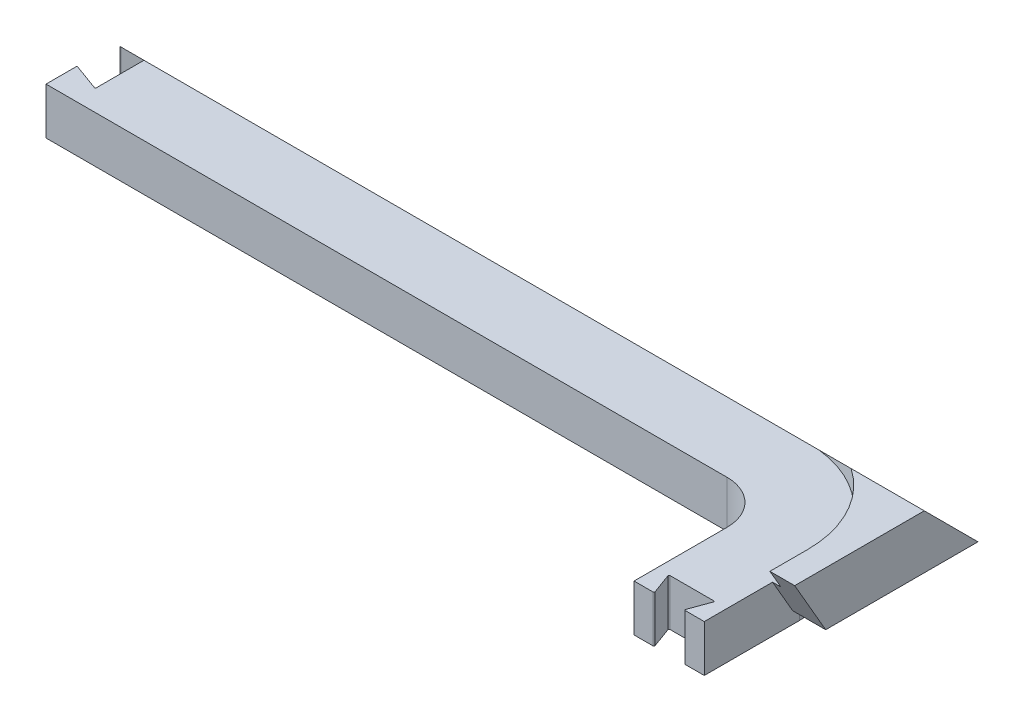
ISO-10303-21;
HEADER;
FILE_DESCRIPTION(('STEP AP214'),'2;1');
FILE_NAME('part.step','',(''),(''),'','','');
FILE_SCHEMA(('AUTOMOTIVE_DESIGN { 1 0 10303 214 1 1 1 1 }'));
ENDSEC;
DATA;
#1=APPLICATION_CONTEXT('core data for automotive mechanical design processes');
#2=APPLICATION_PROTOCOL_DEFINITION('international standard','automotive_design',2000,#1);
#3=PRODUCT_CONTEXT('',#1,'mechanical');
#4=PRODUCT('Part','Part','',(#3));
#5=PRODUCT_RELATED_PRODUCT_CATEGORY('part','',(#4));
#6=PRODUCT_DEFINITION_FORMATION('','',#4);
#7=PRODUCT_DEFINITION_CONTEXT('part definition',#1,'design');
#8=PRODUCT_DEFINITION('design','',#6,#7);
#9=PRODUCT_DEFINITION_SHAPE('','',#8);
#10=(LENGTH_UNIT() NAMED_UNIT(*) SI_UNIT(.MILLI.,.METRE.));
#11=(NAMED_UNIT(*) PLANE_ANGLE_UNIT() SI_UNIT($,.RADIAN.));
#12=(NAMED_UNIT(*) SI_UNIT($,.STERADIAN.) SOLID_ANGLE_UNIT());
#13=UNCERTAINTY_MEASURE_WITH_UNIT(LENGTH_MEASURE(1.E-05),#10,'distance_accuracy_value','');
#14=(GEOMETRIC_REPRESENTATION_CONTEXT(3) GLOBAL_UNCERTAINTY_ASSIGNED_CONTEXT((#13)) GLOBAL_UNIT_ASSIGNED_CONTEXT((#10,
#11,#12)) REPRESENTATION_CONTEXT('',''));
#15=CARTESIAN_POINT('',(0.,0.,0.));
#16=DIRECTION('',(0.,0.,1.));
#17=DIRECTION('',(1.,0.,0.));
#18=AXIS2_PLACEMENT_3D('',#15,#16,#17);
#19=CARTESIAN_POINT('',(0.,0.,-307.275));
#20=DIRECTION('',(0.,0.,-1.));
#21=DIRECTION('',(-1.,0.,0.));
#22=AXIS2_PLACEMENT_3D('',#19,#20,#21);
#23=PLANE('',#22);
#24=DIRECTION('',(-1.,0.,0.));
#25=VECTOR('',#24,1.);
#26=CARTESIAN_POINT('',(-357.675,0.,-307.275));
#27=LINE('',#26,#25);
#28=CARTESIAN_POINT('',(-12.3856296013484,0.,-307.275));
#29=VERTEX_POINT('',#28);
#30=CARTESIAN_POINT('',(-17.,0.,-307.275));
#31=VERTEX_POINT('',#30);
#32=EDGE_CURVE('E316',#29,#31,#27,.T.);
#33=ORIENTED_EDGE('',*,*,#32,.F.);
#34=DIRECTION('',(0.,1.,0.));
#35=VECTOR('',#34,1.);
#36=CARTESIAN_POINT('',(-12.3856296013484,0.,-307.275));
#37=LINE('',#36,#35);
#38=CARTESIAN_POINT('',(-12.3856296013484,11.31,-307.275));
#39=VERTEX_POINT('',#38);
#40=EDGE_CURVE('E412',#29,#39,#37,.T.);
#41=ORIENTED_EDGE('',*,*,#40,.T.);
#42=DIRECTION('',(-1.,0.,0.));
#43=VECTOR('',#42,1.);
#44=CARTESIAN_POINT('',(-357.675,11.31,-307.275));
#45=LINE('',#44,#43);
#46=CARTESIAN_POINT('',(-17.,11.31,-307.275));
#47=VERTEX_POINT('',#46);
#48=EDGE_CURVE('E301',#39,#47,#45,.T.);
#49=ORIENTED_EDGE('',*,*,#48,.T.);
#50=DIRECTION('',(0.,-1.,0.));
#51=VECTOR('',#50,1.);
#52=CARTESIAN_POINT('',(-17.,2.9,-307.275));
#53=LINE('',#52,#51);
#54=EDGE_CURVE('E311',#47,#31,#53,.T.);
#55=ORIENTED_EDGE('',*,*,#54,.T.);
#56=EDGE_LOOP('',(#33,#41,#49,#55));
#57=FACE_BOUND('',#56,.T.);
#58=ADVANCED_FACE('F46',(#57),#23,.F.);
#59=CARTESIAN_POINT('',(-192.3375,0.,0.));
#60=DIRECTION('',(-1.,0.,0.));
#61=DIRECTION('',(0.,0.,1.));
#62=AXIS2_PLACEMENT_3D('',#59,#60,#61);
#63=PLANE('',#62);
#64=DIRECTION('',(0.,0.,1.));
#65=VECTOR('',#64,1.);
#66=CARTESIAN_POINT('',(-192.3375,2.9,0.));
#67=LINE('',#66,#65);
#68=CARTESIAN_POINT('',(-192.3375,2.9,-365.530226968426));
#69=VERTEX_POINT('',#68);
#70=CARTESIAN_POINT('',(-192.3375,2.9,-358.288243085561));
#71=VERTEX_POINT('',#70);
#72=EDGE_CURVE('E306',#69,#71,#67,.T.);
#73=ORIENTED_EDGE('',*,*,#72,.T.);
#74=DIRECTION('',(0.,1.,0.));
#75=VECTOR('',#74,1.);
#76=CARTESIAN_POINT('',(-192.3375,10.4276134842131,-358.288243085561));
#77=LINE('',#76,#75);
#78=CARTESIAN_POINT('',(-192.3375,10.1419838828646,-358.288243085561));
#79=VERTEX_POINT('',#78);
#80=EDGE_CURVE('E396',#71,#79,#77,.T.);
#81=ORIENTED_EDGE('',*,*,#80,.T.);
#82=DIRECTION('',(0.,-0.707106781186551,-0.707106781186544));
#83=VECTOR('',#82,1.);
#84=CARTESIAN_POINT('',(-192.3375,-2.49586231119696,-370.926089279623));
#85=LINE('',#84,#83);
#86=EDGE_CURVE('E298',#79,#69,#85,.T.);
#87=ORIENTED_EDGE('',*,*,#86,.T.);
#88=EDGE_LOOP('',(#73,#81,#87));
#89=FACE_BOUND('',#88,.T.);
#90=ADVANCED_FACE('F616',(#89),#63,.T.);
#91=CARTESIAN_POINT('',(0.,11.31,-307.275));
#92=VERTEX_POINT('',#91);
#93=CARTESIAN_POINT('',(-4.61437039865159,11.31,-307.275));
#94=VERTEX_POINT('',#93);
#95=EDGE_CURVE('E307',#92,#94,#45,.T.);
#96=ORIENTED_EDGE('',*,*,#95,.T.);
#97=DIRECTION('',(0.,1.,0.));
#98=VECTOR('',#97,1.);
#99=CARTESIAN_POINT('',(-4.61437039865159,0.,-307.275));
#100=LINE('',#99,#98);
#101=CARTESIAN_POINT('',(-4.61437039865159,0.,-307.275));
#102=VERTEX_POINT('',#101);
#103=EDGE_CURVE('E437',#94,#102,#100,.F.);
#104=ORIENTED_EDGE('',*,*,#103,.T.);
#105=CARTESIAN_POINT('',(0.,0.,-307.275));
#106=VERTEX_POINT('',#105);
#107=EDGE_CURVE('E322',#106,#102,#27,.T.);
#108=ORIENTED_EDGE('',*,*,#107,.F.);
#109=DIRECTION('',(0.,-1.,0.));
#110=VECTOR('',#109,1.);
#111=CARTESIAN_POINT('',(0.,2.9,-307.275));
#112=LINE('',#111,#110);
#113=EDGE_CURVE('E317',#92,#106,#112,.T.);
#114=ORIENTED_EDGE('',*,*,#113,.F.);
#115=EDGE_LOOP('',(#96,#104,#108,#114));
#116=FACE_BOUND('',#115,.T.);
#117=ADVANCED_FACE('F618',(#116),#23,.F.);
#118=DIRECTION('',(0.,0.,1.));
#119=VECTOR('',#118,1.);
#120=CARTESIAN_POINT('',(-192.3375,11.31,-330.275));
#121=LINE('',#120,#119);
#122=CARTESIAN_POINT('',(-192.3375,11.31,-347.516983882865));
#123=VERTEX_POINT('',#122);
#124=CARTESIAN_POINT('',(-192.3375,11.31,-340.275));
#125=VERTEX_POINT('',#124);
#126=EDGE_CURVE('E318',#123,#125,#121,.T.);
#127=ORIENTED_EDGE('',*,*,#126,.F.);
#128=DIRECTION('',(0.,1.,0.));
#129=VECTOR('',#128,1.);
#130=CARTESIAN_POINT('',(-192.3375,0.,-347.516983882865));
#131=LINE('',#130,#129);
#132=CARTESIAN_POINT('',(-192.3375,0.,-347.516983882865));
#133=VERTEX_POINT('',#132);
#134=EDGE_CURVE('E378',#123,#133,#131,.F.);
#135=ORIENTED_EDGE('',*,*,#134,.T.);
#136=DIRECTION('',(0.,0.,1.));
#137=VECTOR('',#136,1.);
#138=CARTESIAN_POINT('',(-192.3375,0.,-330.275));
#139=LINE('',#138,#137);
#140=CARTESIAN_POINT('',(-192.3375,0.,-340.275));
#141=VERTEX_POINT('',#140);
#142=EDGE_CURVE('E303',#133,#141,#139,.T.);
#143=ORIENTED_EDGE('',*,*,#142,.T.);
#144=DIRECTION('',(0.,-1.,0.));
#145=VECTOR('',#144,1.);
#146=CARTESIAN_POINT('',(-192.3375,2.9,-340.275));
#147=LINE('',#146,#145);
#148=EDGE_CURVE('E312',#125,#141,#147,.T.);
#149=ORIENTED_EDGE('',*,*,#148,.F.);
#150=EDGE_LOOP('',(#127,#135,#143,#149));
#151=FACE_BOUND('',#150,.T.);
#152=ADVANCED_FACE('F625',(#151),#63,.T.);
#153=CARTESIAN_POINT('',(-357.675,0.,-330.275));
#154=DIRECTION('',(0.,1.,0.));
#155=DIRECTION('',(0.,0.,1.));
#156=AXIS2_PLACEMENT_3D('',#153,#154,#155);
#157=PLANE('',#156);
#158=ORIENTED_EDGE('',*,*,#142,.F.);
#159=CARTESIAN_POINT('',(-192.1375,0.,-347.516983882865));
#160=DIRECTION('',(0.,1.,0.));
#161=DIRECTION('',(0.,0.,1.));
#162=AXIS2_PLACEMENT_3D('',#159,#160,#161);
#163=CIRCLE('',#162,0.2);
#164=CARTESIAN_POINT('',(-192.069095971335,0.,-347.704922407022));
#165=VERTEX_POINT('',#164);
#166=EDGE_CURVE('E387',#133,#165,#163,.F.);
#167=ORIENTED_EDGE('',*,*,#166,.T.);
#168=DIRECTION('',(0.939692620785907,0.,0.342020143325674));
#169=VECTOR('',#168,1.);
#170=CARTESIAN_POINT('',(-185.468806451364,0.,-345.302613484213));
#171=LINE('',#170,#169);
#172=CARTESIAN_POINT('',(-185.737210480029,0.,-345.400304561404));
#173=VERTEX_POINT('',#172);
#174=EDGE_CURVE('E266',#165,#173,#171,.T.);
#175=ORIENTED_EDGE('',*,*,#174,.T.);
#176=CARTESIAN_POINT('',(-185.668806451364,0.,-345.588243085561));
#177=DIRECTION('',(0.,1.,0.));
#178=DIRECTION('',(0.,0.,1.));
#179=AXIS2_PLACEMENT_3D('',#176,#177,#178);
#180=CIRCLE('',#179,0.2);
#181=CARTESIAN_POINT('',(-185.468806451364,0.,-345.588243085561));
#182=VERTEX_POINT('',#181);
#183=EDGE_CURVE('E260',#173,#182,#180,.T.);
#184=ORIENTED_EDGE('',*,*,#183,.T.);
#185=DIRECTION('',(0.,0.,-1.));
#186=VECTOR('',#185,1.);
#187=CARTESIAN_POINT('',(-185.468806451364,0.,-360.502613484213));
#188=LINE('',#187,#186);
#189=CARTESIAN_POINT('',(-185.468806451364,0.,-357.275));
#190=VERTEX_POINT('',#189);
#191=EDGE_CURVE('E251',#182,#190,#188,.T.);
#192=ORIENTED_EDGE('',*,*,#191,.T.);
#193=DIRECTION('',(-1.,0.,0.));
#194=VECTOR('',#193,1.);
#195=CARTESIAN_POINT('',(-357.675,0.,-357.275));
#196=LINE('',#195,#194);
#197=CARTESIAN_POINT('',(-27.,0.,-357.275));
#198=VERTEX_POINT('',#197);
#199=EDGE_CURVE('E257',#198,#190,#196,.T.);
#200=ORIENTED_EDGE('',*,*,#199,.F.);
#201=CARTESIAN_POINT('',(-27.,0.,-330.275));
#202=DIRECTION('',(0.,1.,0.));
#203=DIRECTION('',(0.,0.,1.));
#204=AXIS2_PLACEMENT_3D('',#201,#202,#203);
#205=CIRCLE('',#204,27.);
#206=CARTESIAN_POINT('',(0.,0.,-330.275));
#207=VERTEX_POINT('',#206);
#208=EDGE_CURVE('E282',#207,#198,#205,.T.);
#209=ORIENTED_EDGE('',*,*,#208,.F.);
#210=DIRECTION('',(0.,0.,-1.));
#211=VECTOR('',#210,1.);
#212=CARTESIAN_POINT('',(0.,0.,0.));
#213=LINE('',#212,#211);
#214=EDGE_CURVE('E287',#106,#207,#213,.T.);
#215=ORIENTED_EDGE('',*,*,#214,.F.);
#216=ORIENTED_EDGE('',*,*,#107,.T.);
#217=CARTESIAN_POINT('',(-4.61437039865159,0.,-307.475));
#218=DIRECTION('',(0.,1.,0.));
#219=DIRECTION('',(0.,0.,1.));
#220=AXIS2_PLACEMENT_3D('',#217,#218,#219);
#221=CIRCLE('',#220,0.2);
#222=CARTESIAN_POINT('',(-4.80230892280877,0.,-307.543404028665));
#223=VERTEX_POINT('',#222);
#224=EDGE_CURVE('E381',#102,#223,#221,.F.);
#225=ORIENTED_EDGE('',*,*,#224,.T.);
#226=DIRECTION('',(0.342020143325664,0.,-0.93969262078591));
#227=VECTOR('',#226,1.);
#228=CARTESIAN_POINT('',(-4.90000000000001,0.,-307.275));
#229=LINE('',#228,#227);
#230=CARTESIAN_POINT('',(-2.99769107719125,0.,-312.501550810244));
#231=VERTEX_POINT('',#230);
#232=EDGE_CURVE('E475',#223,#231,#229,.T.);
#233=ORIENTED_EDGE('',*,*,#232,.T.);
#234=CARTESIAN_POINT('',(-3.18562960134843,0.,-312.569954838909));
#235=DIRECTION('',(0.,1.,0.));
#236=DIRECTION('',(0.,0.,1.));
#237=AXIS2_PLACEMENT_3D('',#234,#235,#236);
#238=CIRCLE('',#237,0.2);
#239=CARTESIAN_POINT('',(-3.18562960134843,0.,-312.769954838909));
#240=VERTEX_POINT('',#239);
#241=EDGE_CURVE('E11',#231,#240,#238,.T.);
#242=ORIENTED_EDGE('',*,*,#241,.T.);
#243=DIRECTION('',(-1.,0.,0.));
#244=VECTOR('',#243,1.);
#245=CARTESIAN_POINT('',(-2.90000000000001,0.,-312.769954838909));
#246=LINE('',#245,#244);
#247=CARTESIAN_POINT('',(-13.8143703986516,0.,-312.769954838909));
#248=VERTEX_POINT('',#247);
#249=EDGE_CURVE('E473',#240,#248,#246,.T.);
#250=ORIENTED_EDGE('',*,*,#249,.T.);
#251=CARTESIAN_POINT('',(-13.8143703986516,0.,-312.569954838909));
#252=DIRECTION('',(0.,1.,0.));
#253=DIRECTION('',(0.,0.,1.));
#254=AXIS2_PLACEMENT_3D('',#251,#252,#253);
#255=CIRCLE('',#254,0.2);
#256=CARTESIAN_POINT('',(-14.0023089228088,0.,-312.501550810244));
#257=VERTEX_POINT('',#256);
#258=EDGE_CURVE('E453',#248,#257,#255,.T.);
#259=ORIENTED_EDGE('',*,*,#258,.T.);
#260=DIRECTION('',(0.342020143325664,0.,0.93969262078591));
#261=VECTOR('',#260,1.);
#262=CARTESIAN_POINT('',(-14.1,0.,-312.769954838909));
#263=LINE('',#262,#261);
#264=CARTESIAN_POINT('',(-12.1976910771912,0.,-307.543404028665));
#265=VERTEX_POINT('',#264);
#266=EDGE_CURVE('E484',#257,#265,#263,.T.);
#267=ORIENTED_EDGE('',*,*,#266,.T.);
#268=CARTESIAN_POINT('',(-12.3856296013484,0.,-307.475));
#269=DIRECTION('',(0.,1.,0.));
#270=DIRECTION('',(0.,0.,1.));
#271=AXIS2_PLACEMENT_3D('',#268,#269,#270);
#272=CIRCLE('',#271,0.2);
#273=EDGE_CURVE('E384',#265,#29,#272,.F.);
#274=ORIENTED_EDGE('',*,*,#273,.T.);
#275=ORIENTED_EDGE('',*,*,#32,.T.);
#276=DIRECTION('',(0.,0.,-1.));
#277=VECTOR('',#276,1.);
#278=CARTESIAN_POINT('',(-17.,0.,-17.));
#279=LINE('',#278,#277);
#280=CARTESIAN_POINT('',(-17.,0.,-329.775));
#281=VERTEX_POINT('',#280);
#282=EDGE_CURVE('E337',#31,#281,#279,.T.);
#283=ORIENTED_EDGE('',*,*,#282,.T.);
#284=CARTESIAN_POINT('',(-27.5,0.,-329.775));
#285=DIRECTION('',(0.,1.,0.));
#286=DIRECTION('',(0.,0.,1.));
#287=AXIS2_PLACEMENT_3D('',#284,#285,#286);
#288=CIRCLE('',#287,10.5);
#289=CARTESIAN_POINT('',(-27.5,0.,-340.275));
#290=VERTEX_POINT('',#289);
#291=EDGE_CURVE('E506',#281,#290,#288,.T.);
#292=ORIENTED_EDGE('',*,*,#291,.T.);
#293=DIRECTION('',(-1.,0.,0.));
#294=VECTOR('',#293,1.);
#295=CARTESIAN_POINT('',(-367.675,0.,-340.275));
#296=LINE('',#295,#294);
#297=EDGE_CURVE('E293',#290,#141,#296,.T.);
#298=ORIENTED_EDGE('',*,*,#297,.T.);
#299=EDGE_LOOP('',(#158,#167,#175,#184,#192,#200,#209,#215,#216,#225,#233,#242,#250,#259,#267,
#274,#275,#283,#292,#298));
#300=FACE_BOUND('',#299,.T.);
#301=ADVANCED_FACE('F254',(#300),#157,.F.);
#302=CARTESIAN_POINT('',(-27.,2.9,-330.275));
#303=DIRECTION('',(0.,-1.,0.));
#304=DIRECTION('',(0.,0.,-1.));
#305=AXIS2_PLACEMENT_3D('',#302,#303,#304);
#306=CYLINDRICAL_SURFACE('',#305,27.);
#307=ORIENTED_EDGE('',*,*,#208,.T.);
#308=DIRECTION('',(0.,-1.,0.));
#309=VECTOR('',#308,1.);
#310=CARTESIAN_POINT('',(-27.,2.9,-357.275));
#311=LINE('',#310,#309);
#312=CARTESIAN_POINT('',(-27.,2.9,-357.275));
#313=VERTEX_POINT('',#312);
#314=EDGE_CURVE('E280',#313,#198,#311,.T.);
#315=ORIENTED_EDGE('',*,*,#314,.F.);
#316=CARTESIAN_POINT('',(-27.,2.9,-330.275));
#317=DIRECTION('',(0.,1.,0.));
#318=DIRECTION('',(0.,0.,1.));
#319=AXIS2_PLACEMENT_3D('',#316,#317,#318);
#320=CIRCLE('',#319,27.);
#321=CARTESIAN_POINT('',(0.,2.9,-330.275));
#322=VERTEX_POINT('',#321);
#323=EDGE_CURVE('E289',#322,#313,#320,.T.);
#324=ORIENTED_EDGE('',*,*,#323,.F.);
#325=DIRECTION('',(0.,-1.,0.));
#326=VECTOR('',#325,1.);
#327=CARTESIAN_POINT('',(0.,2.9,-330.275));
#328=LINE('',#327,#326);
#329=EDGE_CURVE('E517',#322,#207,#328,.T.);
#330=ORIENTED_EDGE('',*,*,#329,.T.);
#331=EDGE_LOOP('',(#307,#315,#324,#330));
#332=FACE_BOUND('',#331,.T.);
#333=ADVANCED_FACE('F910',(#332),#306,.T.);
#334=CARTESIAN_POINT('',(2.,15.900012,0.));
#335=DIRECTION('',(1.,0.,0.));
#336=DIRECTION('',(0.,0.,-1.));
#337=AXIS2_PLACEMENT_3D('',#334,#335,#336);
#338=PLANE('',#337);
#339=DIRECTION('',(0.,0.,-1.));
#340=VECTOR('',#339,1.);
#341=CARTESIAN_POINT('',(2.,15.9,0.));
#342=LINE('',#341,#340);
#343=CARTESIAN_POINT('',(2.,15.9,-321.157113764813));
#344=VERTEX_POINT('',#343);
#345=CARTESIAN_POINT('',(2.,15.9,-330.275));
#346=VERTEX_POINT('',#345);
#347=EDGE_CURVE('E333',#344,#346,#342,.T.);
#348=ORIENTED_EDGE('',*,*,#347,.T.);
#349=DIRECTION('',(0.,1.,0.));
#350=VECTOR('',#349,1.);
#351=CARTESIAN_POINT('',(2.,11.31,-330.275));
#352=LINE('',#351,#350);
#353=CARTESIAN_POINT('',(2.,11.31,-330.275));
#354=VERTEX_POINT('',#353);
#355=EDGE_CURVE('E326',#354,#346,#352,.T.);
#356=ORIENTED_EDGE('',*,*,#355,.F.);
#357=DIRECTION('',(0.,0.,1.));
#358=VECTOR('',#357,1.);
#359=CARTESIAN_POINT('',(2.,11.31,0.));
#360=LINE('',#359,#358);
#361=CARTESIAN_POINT('',(2.,11.31,-323.807151500394));
#362=VERTEX_POINT('',#361);
#363=EDGE_CURVE('E561',#354,#362,#360,.T.);
#364=ORIENTED_EDGE('',*,*,#363,.T.);
#365=DIRECTION('',(0.,0.866025403784438,0.500000000000001));
#366=VECTOR('',#365,1.);
#367=CARTESIAN_POINT('',(2.,15.9,-321.157113764813));
#368=LINE('',#367,#366);
#369=EDGE_CURVE('E332',#362,#344,#368,.T.);
#370=ORIENTED_EDGE('',*,*,#369,.T.);
#371=EDGE_LOOP('',(#348,#356,#364,#370));
#372=FACE_BOUND('',#371,.T.);
#373=ADVANCED_FACE('F654',(#372),#338,.F.);
#374=CARTESIAN_POINT('',(0.,15.9,-321.157113764813));
#375=DIRECTION('',(0.,-0.500000000000001,0.866025403784438));
#376=DIRECTION('',(0.,-0.866025403784438,-0.500000000000001));
#377=AXIS2_PLACEMENT_3D('',#374,#375,#376);
#378=PLANE('',#377);
#379=ORIENTED_EDGE('',*,*,#369,.F.);
#380=DIRECTION('',(-1.,0.,0.));
#381=VECTOR('',#380,1.);
#382=CARTESIAN_POINT('',(0.,11.31,-323.807151500394));
#383=LINE('',#382,#381);
#384=CARTESIAN_POINT('',(0.,11.31,-323.807151500394));
#385=VERTEX_POINT('',#384);
#386=EDGE_CURVE('E327',#362,#385,#383,.T.);
#387=ORIENTED_EDGE('',*,*,#386,.T.);
#388=DIRECTION('',(0.,-0.866025403784438,-0.500000000000001));
#389=VECTOR('',#388,1.);
#390=CARTESIAN_POINT('',(0.,15.9,-321.157113764813));
#391=LINE('',#390,#389);
#392=CARTESIAN_POINT('',(0.,2.9,-328.662667264279));
#393=VERTEX_POINT('',#392);
#394=EDGE_CURVE('E536',#385,#393,#391,.T.);
#395=ORIENTED_EDGE('',*,*,#394,.T.);
#396=DIRECTION('',(1.,0.,0.));
#397=VECTOR('',#396,1.);
#398=CARTESIAN_POINT('',(0.,2.9,-328.662667264279));
#399=LINE('',#398,#397);
#400=CARTESIAN_POINT('',(8.00000000000001,2.9,-328.662667264279));
#401=VERTEX_POINT('',#400);
#402=EDGE_CURVE('E529',#393,#401,#399,.T.);
#403=ORIENTED_EDGE('',*,*,#402,.T.);
#404=DIRECTION('',(0.,-0.866025403784438,-0.500000000000001));
#405=VECTOR('',#404,1.);
#406=CARTESIAN_POINT('',(8.00000000000001,15.9,-321.157113764813));
#407=LINE('',#406,#405);
#408=CARTESIAN_POINT('',(8.00000000000001,15.9,-321.157113764813));
#409=VERTEX_POINT('',#408);
#410=EDGE_CURVE('E336',#409,#401,#407,.T.);
#411=ORIENTED_EDGE('',*,*,#410,.F.);
#412=DIRECTION('',(1.,0.,0.));
#413=VECTOR('',#412,1.);
#414=CARTESIAN_POINT('',(0.,15.9,-321.157113764813));
#415=LINE('',#414,#413);
#416=EDGE_CURVE('E532',#344,#409,#415,.T.);
#417=ORIENTED_EDGE('',*,*,#416,.F.);
#418=EDGE_LOOP('',(#379,#387,#395,#403,#411,#417));
#419=FACE_BOUND('',#418,.T.);
#420=ADVANCED_FACE('F648',(#419),#378,.T.);
#421=CARTESIAN_POINT('',(0.,2.9,0.));
#422=DIRECTION('',(-1.,0.,0.));
#423=DIRECTION('',(0.,0.,1.));
#424=AXIS2_PLACEMENT_3D('',#421,#422,#423);
#425=PLANE('',#424);
#426=DIRECTION('',(0.,0.,-1.));
#427=VECTOR('',#426,1.);
#428=CARTESIAN_POINT('',(0.,11.31,0.));
#429=LINE('',#428,#427);
#430=EDGE_CURVE('E323',#92,#385,#429,.T.);
#431=ORIENTED_EDGE('',*,*,#430,.F.);
#432=ORIENTED_EDGE('',*,*,#113,.T.);
#433=ORIENTED_EDGE('',*,*,#214,.T.);
#434=ORIENTED_EDGE('',*,*,#329,.F.);
#435=DIRECTION('',(0.,0.,-1.));
#436=VECTOR('',#435,1.);
#437=CARTESIAN_POINT('',(0.,2.9,0.));
#438=LINE('',#437,#436);
#439=EDGE_CURVE('E283',#393,#322,#438,.T.);
#440=ORIENTED_EDGE('',*,*,#439,.F.);
#441=ORIENTED_EDGE('',*,*,#394,.F.);
#442=EDGE_LOOP('',(#431,#432,#433,#434,#440,#441));
#443=FACE_BOUND('',#442,.T.);
#444=ADVANCED_FACE('F641',(#443),#425,.F.);
#445=CARTESIAN_POINT('',(-17.,2.9,-17.));
#446=DIRECTION('',(-1.,0.,0.));
#447=DIRECTION('',(0.,0.,1.));
#448=AXIS2_PLACEMENT_3D('',#445,#446,#447);
#449=PLANE('',#448);
#450=ORIENTED_EDGE('',*,*,#54,.F.);
#451=DIRECTION('',(0.,0.,-1.));
#452=VECTOR('',#451,1.);
#453=CARTESIAN_POINT('',(-17.,11.31,-17.));
#454=LINE('',#453,#452);
#455=CARTESIAN_POINT('',(-17.,11.31,-329.775));
#456=VERTEX_POINT('',#455);
#457=EDGE_CURVE('E328',#47,#456,#454,.T.);
#458=ORIENTED_EDGE('',*,*,#457,.T.);
#459=DIRECTION('',(0.,-1.,0.));
#460=VECTOR('',#459,1.);
#461=CARTESIAN_POINT('',(-17.,0.,-329.775));
#462=LINE('',#461,#460);
#463=EDGE_CURVE('E513',#456,#281,#462,.T.);
#464=ORIENTED_EDGE('',*,*,#463,.T.);
#465=ORIENTED_EDGE('',*,*,#282,.F.);
#466=EDGE_LOOP('',(#450,#458,#464,#465));
#467=FACE_BOUND('',#466,.T.);
#468=ADVANCED_FACE('F605',(#467),#449,.T.);
#469=CARTESIAN_POINT('',(-27.5,2.9,-329.775));
#470=DIRECTION('',(0.,1.,0.));
#471=DIRECTION('',(0.,0.,1.));
#472=AXIS2_PLACEMENT_3D('',#469,#470,#471);
#473=CYLINDRICAL_SURFACE('',#472,10.5);
#474=CARTESIAN_POINT('',(-27.5,11.31,-329.775));
#475=DIRECTION('',(0.,1.,0.));
#476=DIRECTION('',(0.,0.,1.));
#477=AXIS2_PLACEMENT_3D('',#474,#475,#476);
#478=CIRCLE('',#477,10.5);
#479=CARTESIAN_POINT('',(-27.5,11.31,-340.275));
#480=VERTEX_POINT('',#479);
#481=EDGE_CURVE('E331',#480,#456,#478,.F.);
#482=ORIENTED_EDGE('',*,*,#481,.F.);
#483=DIRECTION('',(0.,-1.,0.));
#484=VECTOR('',#483,1.);
#485=CARTESIAN_POINT('',(-27.5,2.9,-340.275));
#486=LINE('',#485,#484);
#487=EDGE_CURVE('E509',#290,#480,#486,.F.);
#488=ORIENTED_EDGE('',*,*,#487,.F.);
#489=ORIENTED_EDGE('',*,*,#291,.F.);
#490=ORIENTED_EDGE('',*,*,#463,.F.);
#491=EDGE_LOOP('',(#482,#488,#489,#490));
#492=FACE_BOUND('',#491,.T.);
#493=ADVANCED_FACE('F600',(#492),#473,.F.);
#494=CARTESIAN_POINT('',(-367.675,2.9,-340.275));
#495=DIRECTION('',(0.,0.,1.));
#496=DIRECTION('',(1.,0.,0.));
#497=AXIS2_PLACEMENT_3D('',#494,#495,#496);
#498=PLANE('',#497);
#499=DIRECTION('',(-1.,0.,0.));
#500=VECTOR('',#499,1.);
#501=CARTESIAN_POINT('',(-367.675,11.31,-340.275));
#502=LINE('',#501,#500);
#503=EDGE_CURVE('E550',#480,#125,#502,.T.);
#504=ORIENTED_EDGE('',*,*,#503,.T.);
#505=ORIENTED_EDGE('',*,*,#148,.T.);
#506=ORIENTED_EDGE('',*,*,#297,.F.);
#507=ORIENTED_EDGE('',*,*,#487,.T.);
#508=EDGE_LOOP('',(#504,#505,#506,#507));
#509=FACE_BOUND('',#508,.T.);
#510=ADVANCED_FACE('F591',(#509),#498,.T.);
#511=CARTESIAN_POINT('',(0.,2.9,0.));
#512=DIRECTION('',(0.,1.,0.));
#513=DIRECTION('',(0.,0.,1.));
#514=AXIS2_PLACEMENT_3D('',#511,#512,#513);
#515=PLANE('',#514);
#516=DIRECTION('',(-0.939692620785907,0.,0.342020143325674));
#517=VECTOR('',#516,1.);
#518=CARTESIAN_POINT('',(-137.559035552329,2.9,-377.940344021975));
#519=LINE('',#518,#517);
#520=CARTESIAN_POINT('',(-185.737210480029,2.9,-360.404922407022));
#521=VERTEX_POINT('',#520);
#522=CARTESIAN_POINT('',(-192.069095971335,2.9,-358.100304561404));
#523=VERTEX_POINT('',#522);
#524=EDGE_CURVE('E302',#521,#523,#519,.T.);
#525=ORIENTED_EDGE('',*,*,#524,.T.);
#526=CARTESIAN_POINT('',(-192.1375,2.9,-358.288243085561));
#527=DIRECTION('',(0.,1.,0.));
#528=DIRECTION('',(0.,0.,1.));
#529=AXIS2_PLACEMENT_3D('',#526,#527,#528);
#530=CIRCLE('',#529,0.2);
#531=EDGE_CURVE('E409',#523,#71,#530,.F.);
#532=ORIENTED_EDGE('',*,*,#531,.T.);
#533=ORIENTED_EDGE('',*,*,#72,.F.);
#534=DIRECTION('',(1.,0.,0.));
#535=VECTOR('',#534,1.);
#536=CARTESIAN_POINT('',(0.,2.9,-365.530226968426));
#537=LINE('',#536,#535);
#538=CARTESIAN_POINT('',(8.,2.90000000000004,-365.530226968426));
#539=VERTEX_POINT('',#538);
#540=EDGE_CURVE('E565',#69,#539,#537,.T.);
#541=ORIENTED_EDGE('',*,*,#540,.T.);
#542=DIRECTION('',(0.,0.,1.));
#543=VECTOR('',#542,1.);
#544=CARTESIAN_POINT('',(8.00000000000006,2.9,0.));
#545=LINE('',#544,#543);
#546=EDGE_CURVE('E526',#539,#401,#545,.T.);
#547=ORIENTED_EDGE('',*,*,#546,.T.);
#548=ORIENTED_EDGE('',*,*,#402,.F.);
#549=ORIENTED_EDGE('',*,*,#439,.T.);
#550=ORIENTED_EDGE('',*,*,#323,.T.);
#551=DIRECTION('',(-1.,0.,0.));
#552=VECTOR('',#551,1.);
#553=CARTESIAN_POINT('',(-357.675,2.9,-357.275));
#554=LINE('',#553,#552);
#555=CARTESIAN_POINT('',(-185.468806451364,2.9,-357.275));
#556=VERTEX_POINT('',#555);
#557=EDGE_CURVE('E295',#313,#556,#554,.T.);
#558=ORIENTED_EDGE('',*,*,#557,.T.);
#559=DIRECTION('',(0.,0.,-1.));
#560=VECTOR('',#559,1.);
#561=CARTESIAN_POINT('',(-185.468806451364,2.9,0.));
#562=LINE('',#561,#560);
#563=CARTESIAN_POINT('',(-185.468806451364,2.9,-360.216983882864));
#564=VERTEX_POINT('',#563);
#565=EDGE_CURVE('E265',#556,#564,#562,.T.);
#566=ORIENTED_EDGE('',*,*,#565,.T.);
#567=CARTESIAN_POINT('',(-185.668806451364,2.9,-360.216983882864));
#568=DIRECTION('',(0.,1.,0.));
#569=DIRECTION('',(0.,0.,1.));
#570=AXIS2_PLACEMENT_3D('',#567,#568,#569);
#571=CIRCLE('',#570,0.2);
#572=EDGE_CURVE('E69',#564,#521,#571,.T.);
#573=ORIENTED_EDGE('',*,*,#572,.T.);
#574=EDGE_LOOP('',(#525,#532,#533,#541,#547,#548,#549,#550,#558,#566,#573));
#575=FACE_BOUND('',#574,.T.);
#576=ADVANCED_FACE('F864',(#575),#515,.F.);
#577=CARTESIAN_POINT('',(8.00000000000006,15.9,0.));
#578=DIRECTION('',(1.,0.,0.));
#579=DIRECTION('',(0.,0.,-1.));
#580=AXIS2_PLACEMENT_3D('',#577,#578,#579);
#581=PLANE('',#580);
#582=DIRECTION('',(0.,-0.707106781186551,-0.707106781186544));
#583=VECTOR('',#582,1.);
#584=CARTESIAN_POINT('',(8.00000000000003,192.165113484213,-176.265113484215));
#585=LINE('',#584,#583);
#586=CARTESIAN_POINT('',(8.00000000000001,15.9,-352.530226968426));
#587=VERTEX_POINT('',#586);
#588=EDGE_CURVE('E566',#587,#539,#585,.T.);
#589=ORIENTED_EDGE('',*,*,#588,.F.);
#590=DIRECTION('',(0.,0.,1.));
#591=VECTOR('',#590,1.);
#592=CARTESIAN_POINT('',(8.00000000000006,15.9,0.));
#593=LINE('',#592,#591);
#594=EDGE_CURVE('E340',#587,#409,#593,.T.);
#595=ORIENTED_EDGE('',*,*,#594,.T.);
#596=ORIENTED_EDGE('',*,*,#410,.T.);
#597=ORIENTED_EDGE('',*,*,#546,.F.);
#598=EDGE_LOOP('',(#589,#595,#596,#597));
#599=FACE_BOUND('',#598,.T.);
#600=ADVANCED_FACE('F854',(#599),#581,.T.);
#601=CARTESIAN_POINT('',(0.,15.9,0.));
#602=DIRECTION('',(0.,1.,0.));
#603=DIRECTION('',(0.,0.,1.));
#604=AXIS2_PLACEMENT_3D('',#601,#602,#603);
#605=PLANE('',#604);
#606=DIRECTION('',(1.,0.,0.));
#607=VECTOR('',#606,1.);
#608=CARTESIAN_POINT('',(-392.675,15.9,-352.530226968426));
#609=LINE('',#608,#607);
#610=CARTESIAN_POINT('',(-9.71259104413583,15.9,-352.530226968426));
#611=VERTEX_POINT('',#610);
#612=EDGE_CURVE('E276',#611,#587,#609,.T.);
#613=ORIENTED_EDGE('',*,*,#612,.F.);
#614=CARTESIAN_POINT('',(-25.,15.9,-330.275));
#615=DIRECTION('',(0.,1.,0.));
#616=DIRECTION('',(0.,0.,1.));
#617=AXIS2_PLACEMENT_3D('',#614,#615,#616);
#618=CIRCLE('',#617,27.);
#619=EDGE_CURVE('E502',#346,#611,#618,.T.);
#620=ORIENTED_EDGE('',*,*,#619,.F.);
#621=ORIENTED_EDGE('',*,*,#347,.F.);
#622=ORIENTED_EDGE('',*,*,#416,.T.);
#623=ORIENTED_EDGE('',*,*,#594,.F.);
#624=EDGE_LOOP('',(#613,#620,#621,#622,#623));
#625=FACE_BOUND('',#624,.T.);
#626=ADVANCED_FACE('F658',(#625),#605,.T.);
#627=CARTESIAN_POINT('',(-25.,11.31,-330.275));
#628=DIRECTION('',(0.,1.,0.));
#629=DIRECTION('',(0.,0.,1.));
#630=AXIS2_PLACEMENT_3D('',#627,#628,#629);
#631=CYLINDRICAL_SURFACE('',#630,27.);
#632=ORIENTED_EDGE('',*,*,#619,.T.);
#633=CARTESIAN_POINT('',(-25.,38.1552269684264,-330.275));
#634=DIRECTION('',(0.,-0.707106781186544,0.707106781186551));
#635=DIRECTION('',(0.,0.707106781186551,0.707106781186544));
#636=AXIS2_PLACEMENT_3D('',#633,#634,#635);
#637=ELLIPSE('',#636,38.1837661840738,27.);
#638=CARTESIAN_POINT('',(-22.1131697289785,11.31,-357.120226968426));
#639=VERTEX_POINT('',#638);
#640=EDGE_CURVE('E321',#611,#639,#637,.F.);
#641=ORIENTED_EDGE('',*,*,#640,.T.);
#642=CARTESIAN_POINT('',(-25.,11.31,-330.275));
#643=DIRECTION('',(0.,1.,0.));
#644=DIRECTION('',(0.,0.,1.));
#645=AXIS2_PLACEMENT_3D('',#642,#643,#644);
#646=CIRCLE('',#645,27.);
#647=EDGE_CURVE('E557',#354,#639,#646,.T.);
#648=ORIENTED_EDGE('',*,*,#647,.F.);
#649=ORIENTED_EDGE('',*,*,#355,.T.);
#650=EDGE_LOOP('',(#632,#641,#648,#649));
#651=FACE_BOUND('',#650,.T.);
#652=ADVANCED_FACE('F661',(#651),#631,.F.);
#653=CARTESIAN_POINT('',(-357.675,11.31,-330.275));
#654=DIRECTION('',(0.,1.,0.));
#655=DIRECTION('',(0.,0.,1.));
#656=AXIS2_PLACEMENT_3D('',#653,#654,#655);
#657=PLANE('',#656);
#658=DIRECTION('',(0.939692620785907,0.,0.342020143325674));
#659=VECTOR('',#658,1.);
#660=CARTESIAN_POINT('',(-332.700920169578,11.31,-398.89072040574));
#661=LINE('',#660,#659);
#662=CARTESIAN_POINT('',(-192.069095971335,11.31,-347.704922407022));
#663=VERTEX_POINT('',#662);
#664=CARTESIAN_POINT('',(-185.737210480029,11.31,-345.400304561404));
#665=VERTEX_POINT('',#664);
#666=EDGE_CURVE('E346',#663,#665,#661,.T.);
#667=ORIENTED_EDGE('',*,*,#666,.F.);
#668=CARTESIAN_POINT('',(-192.1375,11.31,-347.516983882865));
#669=DIRECTION('',(0.,1.,0.));
#670=DIRECTION('',(0.,0.,1.));
#671=AXIS2_PLACEMENT_3D('',#668,#669,#670);
#672=CIRCLE('',#671,0.2);
#673=EDGE_CURVE('E375',#663,#123,#672,.T.);
#674=ORIENTED_EDGE('',*,*,#673,.T.);
#675=ORIENTED_EDGE('',*,*,#126,.T.);
#676=ORIENTED_EDGE('',*,*,#503,.F.);
#677=ORIENTED_EDGE('',*,*,#481,.T.);
#678=ORIENTED_EDGE('',*,*,#457,.F.);
#679=ORIENTED_EDGE('',*,*,#48,.F.);
#680=CARTESIAN_POINT('',(-12.3856296013484,11.31,-307.475));
#681=DIRECTION('',(0.,1.,0.));
#682=DIRECTION('',(0.,0.,1.));
#683=AXIS2_PLACEMENT_3D('',#680,#681,#682);
#684=CIRCLE('',#683,0.2);
#685=CARTESIAN_POINT('',(-12.1976910771912,11.31,-307.543404028665));
#686=VERTEX_POINT('',#685);
#687=EDGE_CURVE('E372',#39,#686,#684,.T.);
#688=ORIENTED_EDGE('',*,*,#687,.T.);
#689=DIRECTION('',(0.342020143325664,0.,0.93969262078591));
#690=VECTOR('',#689,1.);
#691=CARTESIAN_POINT('',(-59.9166532959737,11.31,-438.65017520458));
#692=LINE('',#691,#690);
#693=CARTESIAN_POINT('',(-14.0023089228088,11.31,-312.501550810244));
#694=VERTEX_POINT('',#693);
#695=EDGE_CURVE('E358',#694,#686,#692,.T.);
#696=ORIENTED_EDGE('',*,*,#695,.F.);
#697=CARTESIAN_POINT('',(-13.8143703986516,11.31,-312.569954838909));
#698=DIRECTION('',(0.,1.,0.));
#699=DIRECTION('',(0.,0.,1.));
#700=AXIS2_PLACEMENT_3D('',#697,#698,#699);
#701=CIRCLE('',#700,0.2);
#702=CARTESIAN_POINT('',(-13.8143703986516,11.31,-312.769954838909));
#703=VERTEX_POINT('',#702);
#704=EDGE_CURVE('E450',#694,#703,#701,.F.);
#705=ORIENTED_EDGE('',*,*,#704,.T.);
#706=DIRECTION('',(-1.,0.,0.));
#707=VECTOR('',#706,1.);
#708=CARTESIAN_POINT('',(-357.675,11.31,-312.769954838909));
#709=LINE('',#708,#707);
#710=CARTESIAN_POINT('',(-3.18562960134844,11.31,-312.769954838909));
#711=VERTEX_POINT('',#710);
#712=EDGE_CURVE('E354',#711,#703,#709,.T.);
#713=ORIENTED_EDGE('',*,*,#712,.F.);
#714=CARTESIAN_POINT('',(-3.18562960134843,11.31,-312.569954838909));
#715=DIRECTION('',(0.,1.,0.));
#716=DIRECTION('',(0.,0.,1.));
#717=AXIS2_PLACEMENT_3D('',#714,#715,#716);
#718=CIRCLE('',#717,0.2);
#719=CARTESIAN_POINT('',(-2.99769107719129,11.31,-312.501550810244));
#720=VERTEX_POINT('',#719);
#721=EDGE_CURVE('E55',#711,#720,#718,.F.);
#722=ORIENTED_EDGE('',*,*,#721,.T.);
#723=DIRECTION('',(0.342020143325664,0.,-0.93969262078591));
#724=VECTOR('',#723,1.);
#725=CARTESIAN_POINT('',(-38.7747782779551,11.31,-214.204811592285));
#726=LINE('',#725,#724);
#727=CARTESIAN_POINT('',(-4.80230892280881,11.31,-307.543404028665));
#728=VERTEX_POINT('',#727);
#729=EDGE_CURVE('E350',#728,#720,#726,.T.);
#730=ORIENTED_EDGE('',*,*,#729,.F.);
#731=CARTESIAN_POINT('',(-4.61437039865159,11.31,-307.475));
#732=DIRECTION('',(0.,1.,0.));
#733=DIRECTION('',(0.,0.,1.));
#734=AXIS2_PLACEMENT_3D('',#731,#732,#733);
#735=CIRCLE('',#734,0.2);
#736=EDGE_CURVE('E369',#728,#94,#735,.T.);
#737=ORIENTED_EDGE('',*,*,#736,.T.);
#738=ORIENTED_EDGE('',*,*,#95,.F.);
#739=ORIENTED_EDGE('',*,*,#430,.T.);
#740=ORIENTED_EDGE('',*,*,#386,.F.);
#741=ORIENTED_EDGE('',*,*,#363,.F.);
#742=ORIENTED_EDGE('',*,*,#647,.T.);
#743=DIRECTION('',(1.,0.,0.));
#744=VECTOR('',#743,1.);
#745=CARTESIAN_POINT('',(-357.675,11.31,-357.120226968426));
#746=LINE('',#745,#744);
#747=CARTESIAN_POINT('',(-185.468806451364,11.31,-357.120226968426));
#748=VERTEX_POINT('',#747);
#749=EDGE_CURVE('E570',#748,#639,#746,.T.);
#750=ORIENTED_EDGE('',*,*,#749,.F.);
#751=DIRECTION('',(0.,0.,-1.));
#752=VECTOR('',#751,1.);
#753=CARTESIAN_POINT('',(-185.468806451364,11.31,-330.275));
#754=LINE('',#753,#752);
#755=CARTESIAN_POINT('',(-185.468806451364,11.31,-345.588243085561));
#756=VERTEX_POINT('',#755);
#757=EDGE_CURVE('E493',#756,#748,#754,.T.);
#758=ORIENTED_EDGE('',*,*,#757,.F.);
#759=CARTESIAN_POINT('',(-185.668806451364,11.31,-345.588243085561));
#760=DIRECTION('',(0.,1.,0.));
#761=DIRECTION('',(0.,0.,1.));
#762=AXIS2_PLACEMENT_3D('',#759,#760,#761);
#763=CIRCLE('',#762,0.2);
#764=EDGE_CURVE('E440',#756,#665,#763,.F.);
#765=ORIENTED_EDGE('',*,*,#764,.T.);
#766=EDGE_LOOP('',(#667,#674,#675,#676,#677,#678,#679,#688,#696,#705,#713,#722,#730,#737,#738,
#739,#740,#741,#742,#750,#758,#765));
#767=FACE_BOUND('',#766,.T.);
#768=ADVANCED_FACE('F460',(#767),#657,.T.);
#769=CARTESIAN_POINT('',(-392.675,-2.49586231119696,-370.926089279623));
#770=DIRECTION('',(0.,-0.707106781186544,0.707106781186551));
#771=DIRECTION('',(0.,-0.707106781186551,-0.707106781186544));
#772=AXIS2_PLACEMENT_3D('',#769,#770,#771);
#773=PLANE('',#772);
#774=ORIENTED_EDGE('',*,*,#86,.F.);
#775=CARTESIAN_POINT('',(-192.1375,10.1419838828646,-358.288243085561));
#776=DIRECTION('',(0.,-0.707106781186544,0.707106781186551));
#777=DIRECTION('',(0.,-0.707106781186551,-0.707106781186544));
#778=AXIS2_PLACEMENT_3D('',#775,#776,#777);
#779=ELLIPSE('',#778,0.282842712474621,0.2);
#780=CARTESIAN_POINT('',(-192.069095971335,10.3299224070218,-358.100304561404));
#781=VERTEX_POINT('',#780);
#782=EDGE_CURVE('E400',#79,#781,#779,.F.);
#783=ORIENTED_EDGE('',*,*,#782,.T.);
#784=DIRECTION('',(0.889126490715984,-0.323615577118192,-0.323615577118188));
#785=VECTOR('',#784,1.);
#786=CARTESIAN_POINT('',(-343.276415214309,65.3648858146529,-303.065341153774));
#787=LINE('',#786,#785);
#788=CARTESIAN_POINT('',(-185.737210480029,8.0253045614043,-360.404922407022));
#789=VERTEX_POINT('',#788);
#790=EDGE_CURVE('E275',#781,#789,#787,.T.);
#791=ORIENTED_EDGE('',*,*,#790,.T.);
#792=CARTESIAN_POINT('',(-185.668806451364,8.21324308556147,-360.216983882864));
#793=DIRECTION('',(0.,-0.707106781186544,0.707106781186551));
#794=DIRECTION('',(0.,-0.707106781186551,-0.707106781186544));
#795=AXIS2_PLACEMENT_3D('',#792,#793,#794);
#796=ELLIPSE('',#795,0.282842712474621,0.2);
#797=CARTESIAN_POINT('',(-185.468806451364,8.21324308556145,-360.216983882864));
#798=VERTEX_POINT('',#797);
#799=EDGE_CURVE('E445',#789,#798,#796,.T.);
#800=ORIENTED_EDGE('',*,*,#799,.T.);
#801=DIRECTION('',(0.,0.707106781186551,0.707106781186544));
#802=VECTOR('',#801,1.);
#803=CARTESIAN_POINT('',(-185.468806451364,-2.49586231119695,-370.926089279623));
#804=LINE('',#803,#802);
#805=EDGE_CURVE('E490',#798,#748,#804,.T.);
#806=ORIENTED_EDGE('',*,*,#805,.T.);
#807=ORIENTED_EDGE('',*,*,#749,.T.);
#808=ORIENTED_EDGE('',*,*,#640,.F.);
#809=ORIENTED_EDGE('',*,*,#612,.T.);
#810=ORIENTED_EDGE('',*,*,#588,.T.);
#811=ORIENTED_EDGE('',*,*,#540,.F.);
#812=EDGE_LOOP('',(#774,#783,#791,#800,#806,#807,#808,#809,#810,#811));
#813=FACE_BOUND('',#812,.T.);
#814=ADVANCED_FACE('F667',(#813),#773,.F.);
#815=CARTESIAN_POINT('',(-357.675,2.9,-357.275));
#816=DIRECTION('',(0.,0.,1.));
#817=DIRECTION('',(1.,0.,0.));
#818=AXIS2_PLACEMENT_3D('',#815,#816,#817);
#819=PLANE('',#818);
#820=ORIENTED_EDGE('',*,*,#199,.T.);
#821=DIRECTION('',(0.,1.,0.));
#822=VECTOR('',#821,1.);
#823=CARTESIAN_POINT('',(-185.468806451364,2.9,-357.275));
#824=LINE('',#823,#822);
#825=EDGE_CURVE('E269',#190,#556,#824,.T.);
#826=ORIENTED_EDGE('',*,*,#825,.T.);
#827=ORIENTED_EDGE('',*,*,#557,.F.);
#828=ORIENTED_EDGE('',*,*,#314,.T.);
#829=EDGE_LOOP('',(#820,#826,#827,#828));
#830=FACE_BOUND('',#829,.T.);
#831=ADVANCED_FACE('F279',(#830),#819,.F.);
#832=CARTESIAN_POINT('',(-192.3375,0.,-358.002613484213));
#833=DIRECTION('',(-0.342020143325674,0.,-0.939692620785907));
#834=DIRECTION('',(-0.939692620785907,0.,0.342020143325674));
#835=AXIS2_PLACEMENT_3D('',#832,#833,#834);
#836=PLANE('',#835);
#837=ORIENTED_EDGE('',*,*,#790,.F.);
#838=DIRECTION('',(0.,1.,0.));
#839=VECTOR('',#838,1.);
#840=CARTESIAN_POINT('',(-192.069095971335,2.9,-358.100304561404));
#841=LINE('',#840,#839);
#842=EDGE_CURVE('E62',#781,#523,#841,.F.);
#843=ORIENTED_EDGE('',*,*,#842,.T.);
#844=ORIENTED_EDGE('',*,*,#524,.F.);
#845=DIRECTION('',(0.,1.,0.));
#846=VECTOR('',#845,1.);
#847=CARTESIAN_POINT('',(-185.737210480029,7.92761348421302,-360.404922407022));
#848=LINE('',#847,#846);
#849=EDGE_CURVE('E403',#521,#789,#848,.T.);
#850=ORIENTED_EDGE('',*,*,#849,.T.);
#851=EDGE_LOOP('',(#837,#843,#844,#850));
#852=FACE_BOUND('',#851,.T.);
#853=ADVANCED_FACE('F798',(#852),#836,.F.);
#854=CARTESIAN_POINT('',(-185.468806451364,0.,-360.502613484213));
#855=DIRECTION('',(1.,0.,0.));
#856=DIRECTION('',(0.,0.,-1.));
#857=AXIS2_PLACEMENT_3D('',#854,#855,#856);
#858=PLANE('',#857);
#859=ORIENTED_EDGE('',*,*,#191,.F.);
#860=DIRECTION('',(0.,1.,0.));
#861=VECTOR('',#860,1.);
#862=CARTESIAN_POINT('',(-185.468806451364,11.31,-345.588243085561));
#863=LINE('',#862,#861);
#864=EDGE_CURVE('E393',#182,#756,#863,.T.);
#865=ORIENTED_EDGE('',*,*,#864,.T.);
#866=ORIENTED_EDGE('',*,*,#757,.T.);
#867=ORIENTED_EDGE('',*,*,#805,.F.);
#868=DIRECTION('',(0.,1.,0.));
#869=VECTOR('',#868,1.);
#870=CARTESIAN_POINT('',(-185.468806451364,2.9,-360.216983882864));
#871=LINE('',#870,#869);
#872=EDGE_CURVE('E390',#798,#564,#871,.F.);
#873=ORIENTED_EDGE('',*,*,#872,.T.);
#874=ORIENTED_EDGE('',*,*,#565,.F.);
#875=ORIENTED_EDGE('',*,*,#825,.F.);
#876=EDGE_LOOP('',(#859,#865,#866,#867,#873,#874,#875));
#877=FACE_BOUND('',#876,.T.);
#878=ADVANCED_FACE('F270',(#877),#858,.F.);
#879=CARTESIAN_POINT('',(-185.468806451364,0.,-345.302613484213));
#880=DIRECTION('',(-0.342020143325674,0.,0.939692620785907));
#881=DIRECTION('',(0.939692620785907,0.,0.342020143325674));
#882=AXIS2_PLACEMENT_3D('',#879,#880,#881);
#883=PLANE('',#882);
#884=ORIENTED_EDGE('',*,*,#174,.F.);
#885=DIRECTION('',(0.,1.,0.));
#886=VECTOR('',#885,1.);
#887=CARTESIAN_POINT('',(-192.069095971335,11.31,-347.704922407022));
#888=LINE('',#887,#886);
#889=EDGE_CURVE('E365',#165,#663,#888,.T.);
#890=ORIENTED_EDGE('',*,*,#889,.T.);
#891=ORIENTED_EDGE('',*,*,#666,.T.);
#892=DIRECTION('',(0.,1.,0.));
#893=VECTOR('',#892,1.);
#894=CARTESIAN_POINT('',(-185.737210480029,0.,-345.400304561404));
#895=LINE('',#894,#893);
#896=EDGE_CURVE('E362',#665,#173,#895,.F.);
#897=ORIENTED_EDGE('',*,*,#896,.T.);
#898=EDGE_LOOP('',(#884,#890,#891,#897));
#899=FACE_BOUND('',#898,.T.);
#900=ADVANCED_FACE('F675',(#899),#883,.F.);
#901=CARTESIAN_POINT('',(-14.1,0.,-312.769954838909));
#902=DIRECTION('',(-0.93969262078591,0.,0.342020143325664));
#903=DIRECTION('',(0.342020143325664,0.,0.93969262078591));
#904=AXIS2_PLACEMENT_3D('',#901,#902,#903);
#905=PLANE('',#904);
#906=ORIENTED_EDGE('',*,*,#695,.T.);
#907=DIRECTION('',(0.,1.,0.));
#908=VECTOR('',#907,1.);
#909=CARTESIAN_POINT('',(-12.1976910771912,0.,-307.543404028665));
#910=LINE('',#909,#908);
#911=EDGE_CURVE('E420',#686,#265,#910,.F.);
#912=ORIENTED_EDGE('',*,*,#911,.T.);
#913=ORIENTED_EDGE('',*,*,#266,.F.);
#914=DIRECTION('',(0.,1.,0.));
#915=VECTOR('',#914,1.);
#916=CARTESIAN_POINT('',(-14.0023089228088,11.31,-312.501550810244));
#917=LINE('',#916,#915);
#918=EDGE_CURVE('E416',#257,#694,#917,.T.);
#919=ORIENTED_EDGE('',*,*,#918,.T.);
#920=EDGE_LOOP('',(#906,#912,#913,#919));
#921=FACE_BOUND('',#920,.T.);
#922=ADVANCED_FACE('F768',(#921),#905,.F.);
#923=CARTESIAN_POINT('',(-2.90000000000001,0.,-312.769954838909));
#924=DIRECTION('',(0.,0.,-1.));
#925=DIRECTION('',(-1.,0.,0.));
#926=AXIS2_PLACEMENT_3D('',#923,#924,#925);
#927=PLANE('',#926);
#928=ORIENTED_EDGE('',*,*,#712,.T.);
#929=DIRECTION('',(0.,1.,0.));
#930=VECTOR('',#929,1.);
#931=CARTESIAN_POINT('',(-13.8143703986516,0.,-312.769954838909));
#932=LINE('',#931,#930);
#933=EDGE_CURVE('E427',#703,#248,#932,.F.);
#934=ORIENTED_EDGE('',*,*,#933,.T.);
#935=ORIENTED_EDGE('',*,*,#249,.F.);
#936=DIRECTION('',(0.,1.,0.));
#937=VECTOR('',#936,1.);
#938=CARTESIAN_POINT('',(-3.18562960134843,11.31,-312.769954838909));
#939=LINE('',#938,#937);
#940=EDGE_CURVE('E423',#240,#711,#939,.T.);
#941=ORIENTED_EDGE('',*,*,#940,.T.);
#942=EDGE_LOOP('',(#928,#934,#935,#941));
#943=FACE_BOUND('',#942,.T.);
#944=ADVANCED_FACE('F477',(#943),#927,.F.);
#945=CARTESIAN_POINT('',(-4.90000000000001,0.,-307.275));
#946=DIRECTION('',(0.93969262078591,0.,0.342020143325664));
#947=DIRECTION('',(0.342020143325664,0.,-0.93969262078591));
#948=AXIS2_PLACEMENT_3D('',#945,#946,#947);
#949=PLANE('',#948);
#950=ORIENTED_EDGE('',*,*,#729,.T.);
#951=DIRECTION('',(0.,1.,0.));
#952=VECTOR('',#951,1.);
#953=CARTESIAN_POINT('',(-2.99769107719124,0.,-312.501550810244));
#954=LINE('',#953,#952);
#955=EDGE_CURVE('E434',#720,#231,#954,.F.);
#956=ORIENTED_EDGE('',*,*,#955,.T.);
#957=ORIENTED_EDGE('',*,*,#232,.F.);
#958=DIRECTION('',(0.,1.,0.));
#959=VECTOR('',#958,1.);
#960=CARTESIAN_POINT('',(-4.80230892280877,0.,-307.543404028665));
#961=LINE('',#960,#959);
#962=EDGE_CURVE('E430',#223,#728,#961,.T.);
#963=ORIENTED_EDGE('',*,*,#962,.T.);
#964=EDGE_LOOP('',(#950,#956,#957,#963));
#965=FACE_BOUND('',#964,.T.);
#966=ADVANCED_FACE('F465',(#965),#949,.F.);
#967=CARTESIAN_POINT('',(-192.1375,0.,-347.516983882865));
#968=DIRECTION('',(0.,-1.,0.));
#969=DIRECTION('',(0.,0.,-1.));
#970=AXIS2_PLACEMENT_3D('',#967,#968,#969);
#971=CYLINDRICAL_SURFACE('',#970,0.2);
#972=ORIENTED_EDGE('',*,*,#166,.F.);
#973=ORIENTED_EDGE('',*,*,#134,.F.);
#974=ORIENTED_EDGE('',*,*,#673,.F.);
#975=ORIENTED_EDGE('',*,*,#889,.F.);
#976=EDGE_LOOP('',(#972,#973,#974,#975));
#977=FACE_BOUND('',#976,.T.);
#978=ADVANCED_FACE('F679',(#977),#971,.T.);
#979=CARTESIAN_POINT('',(-185.668806451364,0.,-345.588243085561));
#980=DIRECTION('',(0.,-1.,0.));
#981=DIRECTION('',(0.,0.,-1.));
#982=AXIS2_PLACEMENT_3D('',#979,#980,#981);
#983=CYLINDRICAL_SURFACE('',#982,0.2);
#984=ORIENTED_EDGE('',*,*,#183,.F.);
#985=ORIENTED_EDGE('',*,*,#896,.F.);
#986=ORIENTED_EDGE('',*,*,#764,.F.);
#987=ORIENTED_EDGE('',*,*,#864,.F.);
#988=EDGE_LOOP('',(#984,#985,#986,#987));
#989=FACE_BOUND('',#988,.T.);
#990=ADVANCED_FACE('F671',(#989),#983,.F.);
#991=CARTESIAN_POINT('',(-192.1375,0.,-358.288243085561));
#992=DIRECTION('',(0.,-1.,0.));
#993=DIRECTION('',(0.,0.,-1.));
#994=AXIS2_PLACEMENT_3D('',#991,#992,#993);
#995=CYLINDRICAL_SURFACE('',#994,0.2);
#996=ORIENTED_EDGE('',*,*,#531,.F.);
#997=ORIENTED_EDGE('',*,*,#842,.F.);
#998=ORIENTED_EDGE('',*,*,#782,.F.);
#999=ORIENTED_EDGE('',*,*,#80,.F.);
#1000=EDGE_LOOP('',(#996,#997,#998,#999));
#1001=FACE_BOUND('',#1000,.T.);
#1002=ADVANCED_FACE('F689',(#1001),#995,.T.);
#1003=CARTESIAN_POINT('',(-185.668806451364,0.,-360.216983882864));
#1004=DIRECTION('',(0.,-1.,0.));
#1005=DIRECTION('',(0.,0.,-1.));
#1006=AXIS2_PLACEMENT_3D('',#1003,#1004,#1005);
#1007=CYLINDRICAL_SURFACE('',#1006,0.2);
#1008=ORIENTED_EDGE('',*,*,#572,.F.);
#1009=ORIENTED_EDGE('',*,*,#872,.F.);
#1010=ORIENTED_EDGE('',*,*,#799,.F.);
#1011=ORIENTED_EDGE('',*,*,#849,.F.);
#1012=EDGE_LOOP('',(#1008,#1009,#1010,#1011));
#1013=FACE_BOUND('',#1012,.T.);
#1014=ADVANCED_FACE('F696',(#1013),#1007,.F.);
#1015=CARTESIAN_POINT('',(-12.3856296013484,0.,-307.475));
#1016=DIRECTION('',(0.,1.,0.));
#1017=DIRECTION('',(0.,0.,1.));
#1018=AXIS2_PLACEMENT_3D('',#1015,#1016,#1017);
#1019=CYLINDRICAL_SURFACE('',#1018,0.2);
#1020=ORIENTED_EDGE('',*,*,#273,.F.);
#1021=ORIENTED_EDGE('',*,*,#911,.F.);
#1022=ORIENTED_EDGE('',*,*,#687,.F.);
#1023=ORIENTED_EDGE('',*,*,#40,.F.);
#1024=EDGE_LOOP('',(#1020,#1021,#1022,#1023));
#1025=FACE_BOUND('',#1024,.T.);
#1026=ADVANCED_FACE('F700',(#1025),#1019,.T.);
#1027=CARTESIAN_POINT('',(-13.8143703986516,0.,-312.569954838909));
#1028=DIRECTION('',(0.,-1.,0.));
#1029=DIRECTION('',(0.,0.,-1.));
#1030=AXIS2_PLACEMENT_3D('',#1027,#1028,#1029);
#1031=CYLINDRICAL_SURFACE('',#1030,0.2);
#1032=ORIENTED_EDGE('',*,*,#258,.F.);
#1033=ORIENTED_EDGE('',*,*,#933,.F.);
#1034=ORIENTED_EDGE('',*,*,#704,.F.);
#1035=ORIENTED_EDGE('',*,*,#918,.F.);
#1036=EDGE_LOOP('',(#1032,#1033,#1034,#1035));
#1037=FACE_BOUND('',#1036,.T.);
#1038=ADVANCED_FACE('F704',(#1037),#1031,.F.);
#1039=CARTESIAN_POINT('',(-3.18562960134843,0.,-312.569954838909));
#1040=DIRECTION('',(0.,-1.,0.));
#1041=DIRECTION('',(0.,0.,-1.));
#1042=AXIS2_PLACEMENT_3D('',#1039,#1040,#1041);
#1043=CYLINDRICAL_SURFACE('',#1042,0.2);
#1044=ORIENTED_EDGE('',*,*,#241,.F.);
#1045=ORIENTED_EDGE('',*,*,#955,.F.);
#1046=ORIENTED_EDGE('',*,*,#721,.F.);
#1047=ORIENTED_EDGE('',*,*,#940,.F.);
#1048=EDGE_LOOP('',(#1044,#1045,#1046,#1047));
#1049=FACE_BOUND('',#1048,.T.);
#1050=ADVANCED_FACE('F470',(#1049),#1043,.F.);
#1051=CARTESIAN_POINT('',(-4.61437039865159,0.,-307.475));
#1052=DIRECTION('',(0.,1.,0.));
#1053=DIRECTION('',(0.,0.,1.));
#1054=AXIS2_PLACEMENT_3D('',#1051,#1052,#1053);
#1055=CYLINDRICAL_SURFACE('',#1054,0.2);
#1056=ORIENTED_EDGE('',*,*,#224,.F.);
#1057=ORIENTED_EDGE('',*,*,#103,.F.);
#1058=ORIENTED_EDGE('',*,*,#736,.F.);
#1059=ORIENTED_EDGE('',*,*,#962,.F.);
#1060=EDGE_LOOP('',(#1056,#1057,#1058,#1059));
#1061=FACE_BOUND('',#1060,.T.);
#1062=ADVANCED_FACE('F48',(#1061),#1055,.T.);
#1063=CLOSED_SHELL('',(#58,#90,#117,#152,#301,#333,#373,#420,#444,#468,#493,#510,#576,#600,#626,
#652,#768,#814,#831,#853,#878,#900,#922,#944,#966,#978,#990,#1002,#1014,#1026,#1038,#1050,#1062));
#1064=MANIFOLD_SOLID_BREP('B2',#1063);
#1065=ADVANCED_BREP_SHAPE_REPRESENTATION('',(#18,#1064),#14);
#1066=SHAPE_DEFINITION_REPRESENTATION(#9,#1065);
ENDSEC;
END-ISO-10303-21;
